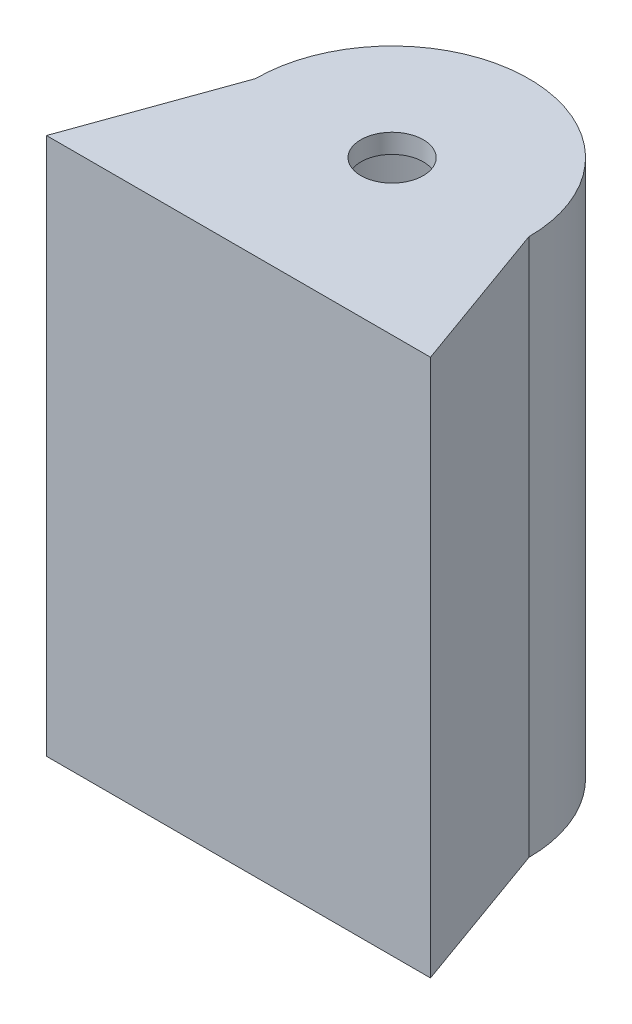
ISO-10303-21;
HEADER;
FILE_DESCRIPTION(('STEP AP214'),'2;1');
FILE_NAME('part.step','',(''),(''),'','','');
FILE_SCHEMA(('AUTOMOTIVE_DESIGN { 1 0 10303 214 1 1 1 1 }'));
ENDSEC;
DATA;
#1=APPLICATION_CONTEXT('core data for automotive mechanical design processes');
#2=APPLICATION_PROTOCOL_DEFINITION('international standard','automotive_design',2000,#1);
#3=PRODUCT_CONTEXT('',#1,'mechanical');
#4=PRODUCT('Part','Part','',(#3));
#5=PRODUCT_RELATED_PRODUCT_CATEGORY('part','',(#4));
#6=PRODUCT_DEFINITION_FORMATION('','',#4);
#7=PRODUCT_DEFINITION_CONTEXT('part definition',#1,'design');
#8=PRODUCT_DEFINITION('design','',#6,#7);
#9=PRODUCT_DEFINITION_SHAPE('','',#8);
#10=(LENGTH_UNIT() NAMED_UNIT(*) SI_UNIT(.MILLI.,.METRE.));
#11=(NAMED_UNIT(*) PLANE_ANGLE_UNIT() SI_UNIT($,.RADIAN.));
#12=(NAMED_UNIT(*) SI_UNIT($,.STERADIAN.) SOLID_ANGLE_UNIT());
#13=UNCERTAINTY_MEASURE_WITH_UNIT(LENGTH_MEASURE(1.E-05),#10,'distance_accuracy_value','');
#14=(GEOMETRIC_REPRESENTATION_CONTEXT(3) GLOBAL_UNCERTAINTY_ASSIGNED_CONTEXT((#13)) GLOBAL_UNIT_ASSIGNED_CONTEXT((#10,
#11,#12)) REPRESENTATION_CONTEXT('',''));
#15=CARTESIAN_POINT('',(0.,0.,0.));
#16=DIRECTION('',(0.,0.,1.));
#17=DIRECTION('',(1.,0.,0.));
#18=AXIS2_PLACEMENT_3D('',#15,#16,#17);
#19=CARTESIAN_POINT('',(0.,-56.,0.));
#20=DIRECTION('',(0.,1.,0.));
#21=DIRECTION('',(0.,0.,1.));
#22=AXIS2_PLACEMENT_3D('',#19,#20,#21);
#23=CYLINDRICAL_SURFACE('',#22,12.75);
#24=CARTESIAN_POINT('',(0.,-56.,0.));
#25=DIRECTION('',(0.,1.,0.));
#26=DIRECTION('',(0.,0.,1.));
#27=AXIS2_PLACEMENT_3D('',#24,#25,#26);
#28=CIRCLE('',#27,12.75);
#29=CARTESIAN_POINT('',(0.,-56.,12.75));
#30=VERTEX_POINT('',#29);
#31=EDGE_CURVE('E108',#30,#30,#28,.T.);
#32=ORIENTED_EDGE('',*,*,#31,.F.);
#33=EDGE_LOOP('',(#32));
#34=FACE_BOUND('',#33,.T.);
#35=CARTESIAN_POINT('',(0.,-2.,0.));
#36=DIRECTION('',(0.,1.,0.));
#37=DIRECTION('',(0.,0.,1.));
#38=AXIS2_PLACEMENT_3D('',#35,#36,#37);
#39=CIRCLE('',#38,12.75);
#40=CARTESIAN_POINT('',(0.,-2.,12.75));
#41=VERTEX_POINT('',#40);
#42=EDGE_CURVE('E11',#41,#41,#39,.F.);
#43=ORIENTED_EDGE('',*,*,#42,.F.);
#44=EDGE_LOOP('',(#43));
#45=FACE_BOUND('',#44,.T.);
#46=ADVANCED_FACE('F39',(#34,#45),#23,.F.);
#47=CARTESIAN_POINT('',(0.,-56.,16.));
#48=DIRECTION('',(0.,0.,1.));
#49=DIRECTION('',(1.,0.,0.));
#50=AXIS2_PLACEMENT_3D('',#47,#48,#49);
#51=PLANE('',#50);
#52=DIRECTION('',(1.,0.,0.));
#53=VECTOR('',#52,1.);
#54=CARTESIAN_POINT('',(0.,0.,16.));
#55=LINE('',#54,#53);
#56=CARTESIAN_POINT('',(-20.,0.,16.));
#57=VERTEX_POINT('',#56);
#58=CARTESIAN_POINT('',(20.,0.,16.));
#59=VERTEX_POINT('',#58);
#60=EDGE_CURVE('E111',#57,#59,#55,.T.);
#61=ORIENTED_EDGE('',*,*,#60,.F.);
#62=DIRECTION('',(0.,1.,0.));
#63=VECTOR('',#62,1.);
#64=CARTESIAN_POINT('',(-20.,-56.,16.));
#65=LINE('',#64,#63);
#66=CARTESIAN_POINT('',(-20.,-56.,16.));
#67=VERTEX_POINT('',#66);
#68=EDGE_CURVE('E48',#67,#57,#65,.T.);
#69=ORIENTED_EDGE('',*,*,#68,.F.);
#70=DIRECTION('',(1.,0.,0.));
#71=VECTOR('',#70,1.);
#72=CARTESIAN_POINT('',(0.,-56.,16.));
#73=LINE('',#72,#71);
#74=CARTESIAN_POINT('',(20.,-56.,16.));
#75=VERTEX_POINT('',#74);
#76=EDGE_CURVE('E101',#67,#75,#73,.T.);
#77=ORIENTED_EDGE('',*,*,#76,.T.);
#78=DIRECTION('',(0.,1.,0.));
#79=VECTOR('',#78,1.);
#80=CARTESIAN_POINT('',(20.,-56.,16.));
#81=LINE('',#80,#79);
#82=EDGE_CURVE('E83',#75,#59,#81,.T.);
#83=ORIENTED_EDGE('',*,*,#82,.T.);
#84=EDGE_LOOP('',(#61,#69,#77,#83));
#85=FACE_BOUND('',#84,.T.);
#86=ADVANCED_FACE('F41',(#85),#51,.T.);
#87=CARTESIAN_POINT('',(-12.6201081081081,-56.,-4.53535135135135));
#88=DIRECTION('',(-0.941074716280074,0.,-0.338198726163151));
#89=DIRECTION('',(-0.338198726163151,0.,0.941074716280074));
#90=AXIS2_PLACEMENT_3D('',#87,#88,#89);
#91=PLANE('',#90);
#92=DIRECTION('',(-0.338198726163151,0.,0.941074716280074));
#93=VECTOR('',#92,1.);
#94=CARTESIAN_POINT('',(-12.6201081081081,0.,-4.53535135135135));
#95=LINE('',#94,#93);
#96=CARTESIAN_POINT('',(-14.25,0.,0.));
#97=VERTEX_POINT('',#96);
#98=EDGE_CURVE('E103',#97,#57,#95,.T.);
#99=ORIENTED_EDGE('',*,*,#98,.F.);
#100=DIRECTION('',(0.,1.,0.));
#101=VECTOR('',#100,1.);
#102=CARTESIAN_POINT('',(-14.25,-56.,0.));
#103=LINE('',#102,#101);
#104=CARTESIAN_POINT('',(-14.25,-56.,0.));
#105=VERTEX_POINT('',#104);
#106=EDGE_CURVE('E72',#105,#97,#103,.T.);
#107=ORIENTED_EDGE('',*,*,#106,.F.);
#108=DIRECTION('',(-0.338198726163151,0.,0.941074716280074));
#109=VECTOR('',#108,1.);
#110=CARTESIAN_POINT('',(-12.6201081081081,-56.,-4.53535135135135));
#111=LINE('',#110,#109);
#112=EDGE_CURVE('E98',#105,#67,#111,.T.);
#113=ORIENTED_EDGE('',*,*,#112,.T.);
#114=ORIENTED_EDGE('',*,*,#68,.T.);
#115=EDGE_LOOP('',(#99,#107,#113,#114));
#116=FACE_BOUND('',#115,.T.);
#117=ADVANCED_FACE('F124',(#116),#91,.T.);
#118=CARTESIAN_POINT('',(0.,-56.,0.));
#119=DIRECTION('',(0.,1.,0.));
#120=DIRECTION('',(0.,0.,1.));
#121=AXIS2_PLACEMENT_3D('',#118,#119,#120);
#122=CYLINDRICAL_SURFACE('',#121,14.25);
#123=CARTESIAN_POINT('',(0.,0.,0.));
#124=DIRECTION('',(0.,1.,0.));
#125=DIRECTION('',(0.,0.,1.));
#126=AXIS2_PLACEMENT_3D('',#123,#124,#125);
#127=CIRCLE('',#126,14.25);
#128=CARTESIAN_POINT('',(14.25,0.,0.));
#129=VERTEX_POINT('',#128);
#130=EDGE_CURVE('E91',#129,#97,#127,.T.);
#131=ORIENTED_EDGE('',*,*,#130,.F.);
#132=DIRECTION('',(0.,1.,0.));
#133=VECTOR('',#132,1.);
#134=CARTESIAN_POINT('',(14.25,-56.,0.));
#135=LINE('',#134,#133);
#136=CARTESIAN_POINT('',(14.25,-56.,0.));
#137=VERTEX_POINT('',#136);
#138=EDGE_CURVE('E86',#137,#129,#135,.T.);
#139=ORIENTED_EDGE('',*,*,#138,.F.);
#140=CARTESIAN_POINT('',(0.,-56.,0.));
#141=DIRECTION('',(0.,1.,0.));
#142=DIRECTION('',(0.,0.,1.));
#143=AXIS2_PLACEMENT_3D('',#140,#141,#142);
#144=CIRCLE('',#143,14.25);
#145=EDGE_CURVE('E89',#137,#105,#144,.T.);
#146=ORIENTED_EDGE('',*,*,#145,.T.);
#147=ORIENTED_EDGE('',*,*,#106,.T.);
#148=EDGE_LOOP('',(#131,#139,#146,#147));
#149=FACE_BOUND('',#148,.T.);
#150=ADVANCED_FACE('F88',(#149),#122,.T.);
#151=CARTESIAN_POINT('',(12.6201081081081,-56.,-4.53535135135135));
#152=DIRECTION('',(0.941074716280074,0.,-0.338198726163152));
#153=DIRECTION('',(-0.338198726163152,0.,-0.941074716280074));
#154=AXIS2_PLACEMENT_3D('',#151,#152,#153);
#155=PLANE('',#154);
#156=DIRECTION('',(-0.338198726163152,0.,-0.941074716280074));
#157=VECTOR('',#156,1.);
#158=CARTESIAN_POINT('',(12.6201081081081,0.,-4.53535135135135));
#159=LINE('',#158,#157);
#160=EDGE_CURVE('E114',#59,#129,#159,.T.);
#161=ORIENTED_EDGE('',*,*,#160,.F.);
#162=ORIENTED_EDGE('',*,*,#82,.F.);
#163=DIRECTION('',(-0.338198726163152,0.,-0.941074716280074));
#164=VECTOR('',#163,1.);
#165=CARTESIAN_POINT('',(12.6201081081081,-56.,-4.53535135135135));
#166=LINE('',#165,#164);
#167=EDGE_CURVE('E97',#75,#137,#166,.T.);
#168=ORIENTED_EDGE('',*,*,#167,.T.);
#169=ORIENTED_EDGE('',*,*,#138,.T.);
#170=EDGE_LOOP('',(#161,#162,#168,#169));
#171=FACE_BOUND('',#170,.T.);
#172=ADVANCED_FACE('F100',(#171),#155,.T.);
#173=CARTESIAN_POINT('',(0.,-56.,0.));
#174=DIRECTION('',(0.,1.,0.));
#175=DIRECTION('',(0.,0.,1.));
#176=AXIS2_PLACEMENT_3D('',#173,#174,#175);
#177=PLANE('',#176);
#178=ORIENTED_EDGE('',*,*,#76,.F.);
#179=ORIENTED_EDGE('',*,*,#112,.F.);
#180=ORIENTED_EDGE('',*,*,#145,.F.);
#181=ORIENTED_EDGE('',*,*,#167,.F.);
#182=EDGE_LOOP('',(#178,#179,#180,#181));
#183=FACE_BOUND('',#182,.T.);
#184=ORIENTED_EDGE('',*,*,#31,.T.);
#185=EDGE_LOOP('',(#184));
#186=FACE_BOUND('',#185,.T.);
#187=ADVANCED_FACE('F95',(#183,#186),#177,.F.);
#188=CARTESIAN_POINT('',(0.,0.,0.));
#189=DIRECTION('',(0.,1.,0.));
#190=DIRECTION('',(0.,0.,1.));
#191=AXIS2_PLACEMENT_3D('',#188,#189,#190);
#192=PLANE('',#191);
#193=ORIENTED_EDGE('',*,*,#60,.T.);
#194=ORIENTED_EDGE('',*,*,#160,.T.);
#195=ORIENTED_EDGE('',*,*,#130,.T.);
#196=ORIENTED_EDGE('',*,*,#98,.T.);
#197=EDGE_LOOP('',(#193,#194,#195,#196));
#198=FACE_BOUND('',#197,.T.);
#199=CARTESIAN_POINT('',(0.,0.,0.));
#200=DIRECTION('',(0.,1.,0.));
#201=DIRECTION('',(0.,0.,1.));
#202=AXIS2_PLACEMENT_3D('',#199,#200,#201);
#203=CIRCLE('',#202,3.25);
#204=CARTESIAN_POINT('',(0.,0.,3.25));
#205=VERTEX_POINT('',#204);
#206=EDGE_CURVE('E158',#205,#205,#203,.T.);
#207=ORIENTED_EDGE('',*,*,#206,.F.);
#208=EDGE_LOOP('',(#207));
#209=FACE_BOUND('',#208,.T.);
#210=ADVANCED_FACE('F122',(#198,#209),#192,.T.);
#211=CARTESIAN_POINT('',(0.,-2.,0.));
#212=DIRECTION('',(0.,1.,0.));
#213=DIRECTION('',(0.,0.,1.));
#214=AXIS2_PLACEMENT_3D('',#211,#212,#213);
#215=PLANE('',#214);
#216=CARTESIAN_POINT('',(0.,-2.,0.));
#217=DIRECTION('',(0.,1.,0.));
#218=DIRECTION('',(0.,0.,1.));
#219=AXIS2_PLACEMENT_3D('',#216,#217,#218);
#220=CIRCLE('',#219,3.25);
#221=CARTESIAN_POINT('',(0.,-2.,3.25));
#222=VERTEX_POINT('',#221);
#223=EDGE_CURVE('E115',#222,#222,#220,.T.);
#224=ORIENTED_EDGE('',*,*,#223,.T.);
#225=EDGE_LOOP('',(#224));
#226=FACE_BOUND('',#225,.T.);
#227=ORIENTED_EDGE('',*,*,#42,.T.);
#228=EDGE_LOOP('',(#227));
#229=FACE_BOUND('',#228,.T.);
#230=ADVANCED_FACE('F142',(#226,#229),#215,.F.);
#231=CARTESIAN_POINT('',(0.,-2.,0.));
#232=DIRECTION('',(0.,1.,0.));
#233=DIRECTION('',(0.,0.,1.));
#234=AXIS2_PLACEMENT_3D('',#231,#232,#233);
#235=CYLINDRICAL_SURFACE('',#234,3.25);
#236=ORIENTED_EDGE('',*,*,#223,.F.);
#237=EDGE_LOOP('',(#236));
#238=FACE_BOUND('',#237,.T.);
#239=ORIENTED_EDGE('',*,*,#206,.T.);
#240=EDGE_LOOP('',(#239));
#241=FACE_BOUND('',#240,.T.);
#242=ADVANCED_FACE('F147',(#238,#241),#235,.F.);
#243=CLOSED_SHELL('',(#46,#86,#117,#150,#172,#187,#210,#230,#242));
#244=MANIFOLD_SOLID_BREP('B2',#243);
#245=ADVANCED_BREP_SHAPE_REPRESENTATION('',(#18,#244),#14);
#246=SHAPE_DEFINITION_REPRESENTATION(#9,#245);
ENDSEC;
END-ISO-10303-21;
